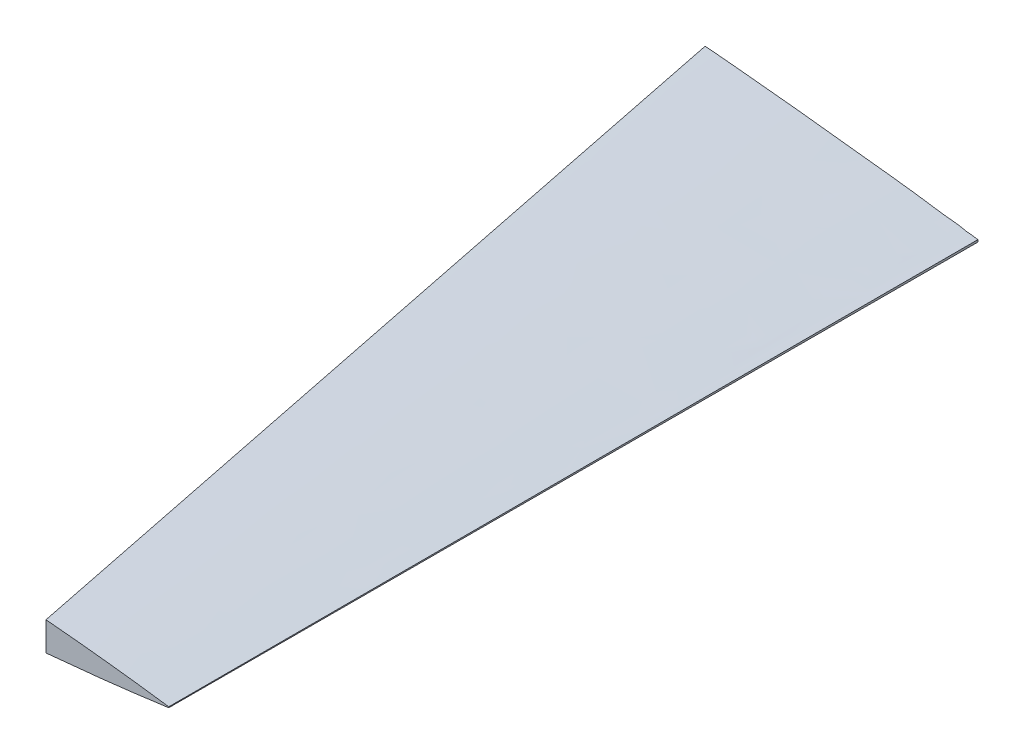
ISO-10303-21;
HEADER;
FILE_DESCRIPTION(('STEP AP214'),'2;1');
FILE_NAME('part.step','',(''),(''),'','','');
FILE_SCHEMA(('AUTOMOTIVE_DESIGN { 1 0 10303 214 1 1 1 1 }'));
ENDSEC;
DATA;
#1=APPLICATION_CONTEXT('core data for automotive mechanical design processes');
#2=APPLICATION_PROTOCOL_DEFINITION('international standard','automotive_design',2000,#1);
#3=PRODUCT_CONTEXT('',#1,'mechanical');
#4=PRODUCT('Part','Part','',(#3));
#5=PRODUCT_RELATED_PRODUCT_CATEGORY('part','',(#4));
#6=PRODUCT_DEFINITION_FORMATION('','',#4);
#7=PRODUCT_DEFINITION_CONTEXT('part definition',#1,'design');
#8=PRODUCT_DEFINITION('design','',#6,#7);
#9=PRODUCT_DEFINITION_SHAPE('','',#8);
#10=(LENGTH_UNIT() NAMED_UNIT(*) SI_UNIT(.MILLI.,.METRE.));
#11=(NAMED_UNIT(*) PLANE_ANGLE_UNIT() SI_UNIT($,.RADIAN.));
#12=(NAMED_UNIT(*) SI_UNIT($,.STERADIAN.) SOLID_ANGLE_UNIT());
#13=UNCERTAINTY_MEASURE_WITH_UNIT(LENGTH_MEASURE(1.E-05),#10,'distance_accuracy_value','');
#14=(GEOMETRIC_REPRESENTATION_CONTEXT(3) GLOBAL_UNCERTAINTY_ASSIGNED_CONTEXT((#13)) GLOBAL_UNIT_ASSIGNED_CONTEXT((#10,
#11,#12)) REPRESENTATION_CONTEXT('',''));
#15=CARTESIAN_POINT('',(0.,0.,0.));
#16=DIRECTION('',(0.,0.,1.));
#17=DIRECTION('',(1.,0.,0.));
#18=AXIS2_PLACEMENT_3D('',#15,#16,#17);
#19=CARTESIAN_POINT('',(229.0496,-21.7539406265103,0.));
#20=DIRECTION('',(-0.983219296408991,0.,0.182427561429213));
#21=DIRECTION('',(0.182427561429213,0.,0.983219296408991));
#22=AXIS2_PLACEMENT_3D('',#19,#20,#21);
#23=PLANE('',#22);
#24=CARTESIAN_POINT('',(229.0496,15.1235468839437,0.));
#25=CARTESIAN_POINT('',(229.482323493886,15.0746152727877,2.33222483414355));
#26=CARTESIAN_POINT('',(229.91504698778,15.025683664147,4.66444966833803));
#27=CARTESIAN_POINT('',(232.078664457303,14.7810256341703,16.3255738395787));
#28=CARTESIAN_POINT('',(233.809558433081,14.5852992525158,25.6544731774296));
#29=CARTESIAN_POINT('',(242.464028312923,13.6066675975319,72.2989698718214));
#30=CARTESIAN_POINT('',(249.387604219846,12.8237630840687,109.614567243774));
#31=CARTESIAN_POINT('',(263.580983422545,11.2188057671984,186.11180375789));
#32=CARTESIAN_POINT('',(270.850786718778,10.3967530852863,225.293442902517));
#33=CARTESIAN_POINT('',(285.390393336545,8.75265444502801,303.65672132814));
#34=CARTESIAN_POINT('',(292.66019665808,7.93060848668191,342.838360609136));
#35=CARTESIAN_POINT('',(299.93,7.10856794526247,382.02));
#36=B_SPLINE_CURVE_WITH_KNOTS('',3,(#24,#25,#26,#27,#28,#29,#30,#31,#32,#33,#34,#35),
.UNSPECIFIED.,.F.,.F.,(4,2,2,2,2,4),(0.,7.11760138076961,35.588006903848,149.469628996162,
269.046131327252,388.622633658346),.UNSPECIFIED.);
#37=CARTESIAN_POINT('',(229.049599998342,15.1235468611055,0.));
#38=VERTEX_POINT('',#37);
#39=CARTESIAN_POINT('',(299.929999841737,7.10856613698917,382.02));
#40=VERTEX_POINT('',#39);
#41=EDGE_CURVE('E103',#38,#40,#36,.T.);
#42=ORIENTED_EDGE('',*,*,#41,.F.);
#43=DIRECTION('',(0.,1.,0.));
#44=VECTOR('',#43,1.);
#45=CARTESIAN_POINT('',(229.0496,-21.7539406265103,0.));
#46=LINE('',#45,#44);
#47=CARTESIAN_POINT('',(229.049599999296,-15.1235468742197,0.));
#48=VERTEX_POINT('',#47);
#49=EDGE_CURVE('E100',#48,#38,#46,.T.);
#50=ORIENTED_EDGE('',*,*,#49,.F.);
#51=CARTESIAN_POINT('',(299.930000010258,-6.48856794352511,382.020000001781));
#52=CARTESIAN_POINT('',(299.497291295983,-6.54128181893893,379.687854848139));
#53=CARTESIAN_POINT('',(299.064582582957,-6.59399572316446,377.355709694916));
#54=CARTESIAN_POINT('',(296.901039022804,-6.85756537930867,365.694983930933));
#55=CARTESIAN_POINT('',(295.170204190612,-7.06842153627714,356.366403326556));
#56=CARTESIAN_POINT('',(286.516030028138,-8.12270390269963,309.723500340702));
#57=CARTESIAN_POINT('',(279.592690693321,-8.96613485689421,272.409178067313));
#58=CARTESIAN_POINT('',(265.419821170055,-10.6927390959512,196.022481434063));
#59=CARTESIAN_POINT('',(258.170290983083,-11.5759125860026,156.950107078567));
#60=CARTESIAN_POINT('',(243.671230782816,-13.3422620347552,78.8053593269384));
#61=CARTESIAN_POINT('',(236.421700769521,-14.2254379934563,39.732985930806));
#62=CARTESIAN_POINT('',(229.131313840076,-15.113592065225,0.440408366572302));
#63=CARTESIAN_POINT('',(229.090456920038,-15.1185694745733,0.220204183285911));
#64=CARTESIAN_POINT('',(229.0496,-15.1235468839438,0.));
#65=B_SPLINE_CURVE_WITH_KNOTS('',3,(#51,#52,#53,#54,#55,#56,#57,#58,#59,#60,#61,#62,#63,#64),
.UNSPECIFIED.,.F.,.F.,(4,2,2,2,2,2,4),(0.,7.11760138076971,35.5880069038481,149.469628996162,
268.716746739496,387.963861723257,388.63591492331),.UNSPECIFIED.);
#66=CARTESIAN_POINT('',(299.929999947683,-6.48856734736256,382.02));
#67=VERTEX_POINT('',#66);
#68=EDGE_CURVE('E95',#67,#48,#65,.T.);
#69=ORIENTED_EDGE('',*,*,#68,.F.);
#70=DIRECTION('',(0.,1.,0.));
#71=VECTOR('',#70,1.);
#72=CARTESIAN_POINT('',(299.93,-21.7539406265103,382.02));
#73=LINE('',#72,#71);
#74=EDGE_CURVE('E97',#67,#40,#73,.T.);
#75=ORIENTED_EDGE('',*,*,#74,.T.);
#76=EDGE_LOOP('',(#42,#50,#69,#75));
#77=FACE_BOUND('',#76,.T.);
#78=ADVANCED_FACE('F45',(#77),#23,.T.);
#79=CARTESIAN_POINT('',(0.,0.,0.));
#80=DIRECTION('',(0.,0.,1.));
#81=DIRECTION('',(1.,0.,0.));
#82=AXIS2_PLACEMENT_3D('',#79,#80,#81);
#83=PLANE('',#82);
#84=CARTESIAN_POINT('',(357.89,0.51,0.));
#85=CARTESIAN_POINT('',(357.719646917638,0.505921572841798,0.));
#86=CARTESIAN_POINT('',(357.031457109049,0.489445604421162,0.));
#87=CARTESIAN_POINT('',(355.448095415412,0.921810978975273,0.));
#88=CARTESIAN_POINT('',(352.680293301441,0.90095439623579,0.));
#89=CARTESIAN_POINT('',(348.957066021364,2.01520125980667,0.));
#90=CARTESIAN_POINT('',(344.0645014606,2.22917896767638,0.));
#91=CARTESIAN_POINT('',(338.235146468501,3.09922065903866,0.));
#92=CARTESIAN_POINT('',(331.393672923208,4.13758684020932,0.));
#93=CARTESIAN_POINT('',(323.597761630089,5.11628057463696,0.));
#94=CARTESIAN_POINT('',(314.882443830129,6.17828912685919,0.));
#95=CARTESIAN_POINT('',(305.293130734855,7.07725232689124,0.));
#96=CARTESIAN_POINT('',(294.985863675319,8.42983706148255,0.));
#97=CARTESIAN_POINT('',(283.977867006548,9.69066102593276,0.));
#98=CARTESIAN_POINT('',(272.375704707007,10.941886728925,0.));
#99=CARTESIAN_POINT('',(260.101492172459,12.2387824025472,0.));
#100=CARTESIAN_POINT('',(247.312075014399,13.4440845936858,0.));
#101=CARTESIAN_POINT('',(234.122924460674,14.8365121456862,0.));
#102=CARTESIAN_POINT('',(220.62780271951,15.648425333477,0.));
#103=CARTESIAN_POINT('',(206.943423861164,17.1374754411791,0.));
#104=CARTESIAN_POINT('',(193.035803629134,17.9766016297824,0.));
#105=CARTESIAN_POINT('',(178.998423130644,19.1472716709331,0.));
#106=CARTESIAN_POINT('',(164.930628496034,19.7652584635785,0.));
#107=CARTESIAN_POINT('',(150.970022584434,20.6192056737092,0.));
#108=CARTESIAN_POINT('',(137.249966534669,21.1393456722067,0.));
#109=CARTESIAN_POINT('',(123.783214426583,21.2841033943283,0.));
#110=CARTESIAN_POINT('',(110.659687231223,21.7439406265103,0.));
#111=CARTESIAN_POINT('',(97.8741361414242,21.2812625614655,0.));
#112=CARTESIAN_POINT('',(85.6735500131455,21.1922492666694,0.));
#113=CARTESIAN_POINT('',(73.9996496969005,20.5135685894506,0.));
#114=CARTESIAN_POINT('',(62.9682496415754,20.2247733516122,0.));
#115=CARTESIAN_POINT('',(52.6401030806784,19.1522879815025,0.));
#116=CARTESIAN_POINT('',(43.1755939216454,17.8091818067298,0.));
#117=CARTESIAN_POINT('',(34.518431340811,16.6108019228167,0.));
#118=CARTESIAN_POINT('',(26.6936934738994,15.1655174934838,0.));
#119=CARTESIAN_POINT('',(19.8862932147171,13.2851537730244,0.));
#120=CARTESIAN_POINT('',(13.8083523401894,11.6800943694312,0.));
#121=CARTESIAN_POINT('',(9.04993148298527,9.28720173126534,0.));
#122=CARTESIAN_POINT('',(4.93777046882712,7.46902396666879,0.));
#123=CARTESIAN_POINT('',(2.40834869494993,4.9776750118051,0.));
#124=CARTESIAN_POINT('',(0.307350295607263,2.75818606627847,0.));
#125=CARTESIAN_POINT('',(-0.145006844762799,0.,0.));
#126=CARTESIAN_POINT('',(0.307350295607263,-2.75818606627847,0.));
#127=CARTESIAN_POINT('',(2.40834869494993,-4.97767501180511,0.));
#128=CARTESIAN_POINT('',(4.9377704688271,-7.46902396666878,0.));
#129=CARTESIAN_POINT('',(9.0499314829853,-9.28720173126536,0.));
#130=CARTESIAN_POINT('',(13.8083523401894,-11.6800943694312,0.));
#131=CARTESIAN_POINT('',(19.8862932147171,-13.2851537730243,0.));
#132=CARTESIAN_POINT('',(26.6936934738993,-15.1655174934838,0.));
#133=CARTESIAN_POINT('',(34.5184313408111,-16.6108019228167,0.));
#134=CARTESIAN_POINT('',(43.1755939216453,-17.8091818067298,0.));
#135=CARTESIAN_POINT('',(52.6401030806785,-19.1522879815025,0.));
#136=CARTESIAN_POINT('',(62.9682496415753,-20.2247733516122,0.));
#137=CARTESIAN_POINT('',(73.9996496969005,-20.5135685894506,0.));
#138=CARTESIAN_POINT('',(85.6735500131454,-21.1922492666694,0.));
#139=CARTESIAN_POINT('',(97.8741361414243,-21.2812625614655,0.));
#140=CARTESIAN_POINT('',(110.659687231223,-21.7439406265103,0.));
#141=CARTESIAN_POINT('',(123.783214426583,-21.2841033943283,0.));
#142=CARTESIAN_POINT('',(137.249966534669,-21.1393456722067,0.));
#143=CARTESIAN_POINT('',(150.970022584434,-20.6192056737092,0.));
#144=CARTESIAN_POINT('',(164.930628496034,-19.7652584635785,0.));
#145=CARTESIAN_POINT('',(178.998423130644,-19.1472716709331,0.));
#146=CARTESIAN_POINT('',(193.035803629134,-17.9766016297824,0.));
#147=CARTESIAN_POINT('',(206.943423861164,-17.1374754411791,0.));
#148=CARTESIAN_POINT('',(220.62780271951,-15.648425333477,0.));
#149=CARTESIAN_POINT('',(234.122924460674,-14.8365121456862,0.));
#150=CARTESIAN_POINT('',(247.312075014399,-13.4440845936858,0.));
#151=CARTESIAN_POINT('',(260.101492172459,-12.2387824025472,0.));
#152=CARTESIAN_POINT('',(272.375704707007,-10.941886728925,0.));
#153=CARTESIAN_POINT('',(283.977867006547,-9.69066102593277,0.));
#154=CARTESIAN_POINT('',(294.985863675319,-8.42983706148255,0.));
#155=CARTESIAN_POINT('',(305.293130734855,-7.07725232689124,0.));
#156=CARTESIAN_POINT('',(314.882443830129,-6.17828912685919,0.));
#157=CARTESIAN_POINT('',(323.597761630088,-5.11628057463696,0.));
#158=CARTESIAN_POINT('',(331.393672923209,-4.13758684020931,0.));
#159=CARTESIAN_POINT('',(338.235146468501,-3.09922065903867,0.));
#160=CARTESIAN_POINT('',(344.0645014606,-2.22917896767638,0.));
#161=CARTESIAN_POINT('',(348.957066021365,-2.01520125980667,0.));
#162=CARTESIAN_POINT('',(352.680293301441,-0.900954396235786,0.));
#163=CARTESIAN_POINT('',(355.448095415412,-0.921810978975272,0.));
#164=CARTESIAN_POINT('',(357.031457109049,-0.489445604421162,0.));
#165=CARTESIAN_POINT('',(357.719646917638,-0.505921572841798,0.));
#166=CARTESIAN_POINT('',(357.89,-0.51,0.));
#167=B_SPLINE_CURVE_WITH_KNOTS('',3,(#84,#85,#86,#87,#88,#89,#90,#91,#92,#93,#94,#95,#96,#97,
#98,#99,#100,#101,#102,#103,#104,#105,#106,#107,#108,#109,#110,#111,#112,#113,#114,#115,#116,
#117,#118,#119,#120,#121,#122,#123,#124,#125,#126,#127,#128,#129,#130,#131,#132,#133,#134,#135,
#136,#137,#138,#139,#140,#141,#142,#143,#144,#145,#146,#147,#148,#149,#150,#151,#152,#153,#154,
#155,#156,#157,#158,#159,#160,#161,#162,#163,#164,#165,#166),.UNSPECIFIED.,.F.,.F.,(4,1,1,1,1,1,
1,1,1,1,1,1,1,1,1,1,1,1,1,1,1,1,1,1,1,1,1,1,1,1,1,1,1,1,1,1,1,1,1,1,1,1,1,1,1,1,1,1,1,1,1,1,1,1,
1,1,1,1,1,1,1,1,1,1,1,1,1,1,1,1,1,1,1,1,1,1,1,1,1,1,4),(0.,0.000698767546102638,
0.00282287057641789,0.00666210294870497,0.0119851512501213,0.0186396801468936,
0.0267087250122721,0.0362091585625878,0.0470822882687063,0.0590024405257511,0.0722964396022678,
0.0866652687945305,0.101727960502694,0.1178390518878,0.134631365152862,0.15245969992926,
0.170642601576784,0.189137461126776,0.208016041696824,0.227206750787311,0.246398452739791,
0.265909542840843,0.285078596718305,0.303889796655365,0.322335219621859,0.340437910137479,
0.357841963230223,0.374903831461308,0.390580026839433,0.405899731285183,0.420244749695898,
0.433227432414806,0.445192580255448,0.456174796493744,0.465885160109924,0.474250152506373,
0.481884938165317,0.48779988101342,0.492476430267749,0.496450404883876,0.5,0.503549595116124,
0.507523569732251,0.51220011898658,0.518115061834683,0.525749847493627,0.534114839890076,
0.543825203506256,0.554807419744552,0.566772567585194,0.579755250304102,0.594100268714817,
0.609419973160567,0.625096168538692,0.642158036769777,0.659562089862521,0.677664780378141,
0.696110203344635,0.714921403281695,0.734090457159157,0.753601547260209,0.772793249212689,
0.791983958303176,0.810862538873224,0.829357398423216,0.847540300070741,0.865368634847139,
0.8821609481122,0.898272039497306,0.91333473120547,0.927703560397732,0.940997559474249,
0.952917711731294,0.963790841437412,0.973291274987728,0.981360319853106,0.988014848749879,
0.993337897051295,0.997177129423582,0.999301232453897,1.),.UNSPECIFIED.);
#168=CARTESIAN_POINT('',(357.89,-0.51,0.));
#169=VERTEX_POINT('',#168);
#170=EDGE_CURVE('E11',#48,#169,#167,.T.);
#171=ORIENTED_EDGE('',*,*,#170,.F.);
#172=ORIENTED_EDGE('',*,*,#49,.T.);
#173=CARTESIAN_POINT('',(357.89,0.51,0.));
#174=VERTEX_POINT('',#173);
#175=EDGE_CURVE('E59',#174,#38,#167,.T.);
#176=ORIENTED_EDGE('',*,*,#175,.F.);
#177=DIRECTION('',(0.,1.,0.));
#178=VECTOR('',#177,1.);
#179=CARTESIAN_POINT('',(357.89,0.51,0.));
#180=LINE('',#179,#178);
#181=EDGE_CURVE('E176',#169,#174,#180,.T.);
#182=ORIENTED_EDGE('',*,*,#181,.F.);
#183=EDGE_LOOP('',(#171,#172,#176,#182));
#184=FACE_BOUND('',#183,.T.);
#185=ADVANCED_FACE('F159',(#184),#83,.F.);
#186=CARTESIAN_POINT('',(357.89,0.,0.));
#187=DIRECTION('',(-1.,0.,0.));
#188=DIRECTION('',(0.,0.,1.));
#189=AXIS2_PLACEMENT_3D('',#186,#187,#188);
#190=PLANE('',#189);
#191=DIRECTION('',(0.,0.,-1.));
#192=VECTOR('',#191,1.);
#193=CARTESIAN_POINT('',(357.89,0.51,191.01));
#194=LINE('',#193,#192);
#195=CARTESIAN_POINT('',(357.89,0.51,382.02));
#196=VERTEX_POINT('',#195);
#197=EDGE_CURVE('E67',#196,#174,#194,.T.);
#198=ORIENTED_EDGE('',*,*,#197,.F.);
#199=DIRECTION('',(0.,1.,0.));
#200=VECTOR('',#199,1.);
#201=CARTESIAN_POINT('',(357.89,0.51,382.02));
#202=LINE('',#201,#200);
#203=CARTESIAN_POINT('',(357.89,0.11,382.02));
#204=VERTEX_POINT('',#203);
#205=EDGE_CURVE('E102',#204,#196,#202,.T.);
#206=ORIENTED_EDGE('',*,*,#205,.F.);
#207=DIRECTION('',(0.,0.00162294954052209,0.999998683016527));
#208=VECTOR('',#207,1.);
#209=CARTESIAN_POINT('',(357.89,-0.2,191.01));
#210=LINE('',#209,#208);
#211=EDGE_CURVE('E115',#169,#204,#210,.T.);
#212=ORIENTED_EDGE('',*,*,#211,.F.);
#213=ORIENTED_EDGE('',*,*,#181,.T.);
#214=EDGE_LOOP('',(#198,#206,#212,#213));
#215=FACE_BOUND('',#214,.T.);
#216=ADVANCED_FACE('F151',(#215),#190,.F.);
#217=CARTESIAN_POINT('',(196.89,0.31,382.02));
#218=DIRECTION('',(0.,0.,-1.));
#219=DIRECTION('',(-1.,0.,0.));
#220=AXIS2_PLACEMENT_3D('',#217,#218,#219);
#221=PLANE('',#220);
#222=ORIENTED_EDGE('',*,*,#74,.F.);
#223=CARTESIAN_POINT('',(357.89,0.51,382.02));
#224=CARTESIAN_POINT('',(357.806708450135,0.523616929023838,382.02));
#225=CARTESIAN_POINT('',(357.477757543041,0.577395507540505,382.02));
#226=CARTESIAN_POINT('',(356.735929251304,0.668207308103863,382.02));
#227=CARTESIAN_POINT('',(355.506721289244,0.843623982290788,382.02));
#228=CARTESIAN_POINT('',(353.79442463927,1.08474454915982,382.02));
#229=CARTESIAN_POINT('',(351.6097148269,1.36786042515621,382.02));
#230=CARTESIAN_POINT('',(348.970793308962,1.72271684994328,382.02));
#231=CARTESIAN_POINT('',(345.890024605038,2.11684627330626,382.02));
#232=CARTESIAN_POINT('',(342.384959477384,2.57296930570351,382.02));
#233=CARTESIAN_POINT('',(338.476676034793,3.04345907258176,382.02));
#234=CARTESIAN_POINT('',(334.194743391836,3.56844857624299,382.02));
#235=CARTESIAN_POINT('',(329.564880021649,4.10702445897474,382.02));
#236=CARTESIAN_POINT('',(324.61053811686,4.65159250747444,382.02));
#237=CARTESIAN_POINT('',(319.36810887888,5.22351623460242,382.02));
#238=CARTESIAN_POINT('',(313.865108349675,5.79444176379778,382.02));
#239=CARTESIAN_POINT('',(308.13727352458,6.34625344854203,382.02));
#240=CARTESIAN_POINT('',(302.218947217218,6.91509363260335,382.02));
#241=CARTESIAN_POINT('',(296.144359296961,7.43556950912298,382.02));
#242=CARTESIAN_POINT('',(289.95852789448,7.95011430848334,382.02));
#243=CARTESIAN_POINT('',(283.695239198178,8.42038142674189,382.02));
#244=CARTESIAN_POINT('',(277.391517886532,8.83757523401212,382.02));
#245=CARTESIAN_POINT('',(271.088226722719,9.20884169747183,382.02));
#246=CARTESIAN_POINT('',(264.824786478958,9.51907856309602,382.02));
#247=CARTESIAN_POINT('',(258.638098512786,9.76488067881417,382.02));
#248=CARTESIAN_POINT('',(252.563996104545,9.91076428473279,382.02));
#249=CARTESIAN_POINT('',(246.643582622431,9.98355420197383,382.02));
#250=CARTESIAN_POINT('',(240.915871684702,9.97223823955458,382.02));
#251=CARTESIAN_POINT('',(235.411809077091,9.83678180894192,382.02));
#252=CARTESIAN_POINT('',(230.166954947183,9.62520799462967,382.02));
#253=CARTESIAN_POINT('',(225.211940853357,9.30819354309595,382.02));
#254=CARTESIAN_POINT('',(220.5796293594,8.89398006186397,382.02));
#255=CARTESIAN_POINT('',(216.293073929223,8.38115666749742,382.02));
#256=CARTESIAN_POINT('',(212.383328821964,7.76783328684578,382.02));
#257=CARTESIAN_POINT('',(208.873840562401,7.07079208424317,382.02));
#258=CARTESIAN_POINT('',(205.780404232968,6.32443658080431,382.02));
#259=CARTESIAN_POINT('',(203.136694712803,5.46428267250967,382.02));
#260=CARTESIAN_POINT('',(200.932972041348,4.57455127871715,382.02));
#261=CARTESIAN_POINT('',(199.183060998198,3.62443268839254,382.02));
#262=CARTESIAN_POINT('',(197.910714361493,2.59930099190346,382.02));
#263=CARTESIAN_POINT('',(197.086986489989,1.50619227407771,382.02));
#264=CARTESIAN_POINT('',(196.797785549145,0.309999999999987,382.02));
#265=CARTESIAN_POINT('',(197.086986489989,-0.886192274077687,382.02));
#266=CARTESIAN_POINT('',(197.910714361493,-1.97930099190348,382.02));
#267=CARTESIAN_POINT('',(199.183060998198,-3.00443268839252,382.02));
#268=CARTESIAN_POINT('',(200.932972041348,-3.95455127871715,382.02));
#269=CARTESIAN_POINT('',(203.136694712803,-4.84428267250967,382.02));
#270=CARTESIAN_POINT('',(205.780404232968,-5.7044365808043,382.02));
#271=CARTESIAN_POINT('',(208.873840562401,-6.45079208424317,382.02));
#272=CARTESIAN_POINT('',(212.383328821964,-7.14783328684577,382.02));
#273=CARTESIAN_POINT('',(216.293073929223,-7.76115666749742,382.02));
#274=CARTESIAN_POINT('',(220.579629359399,-8.27398006186396,382.02));
#275=CARTESIAN_POINT('',(225.211940853357,-8.68819354309595,382.02));
#276=CARTESIAN_POINT('',(230.166954947183,-9.00520799462967,382.02));
#277=CARTESIAN_POINT('',(235.411809077091,-9.21678180894192,382.02));
#278=CARTESIAN_POINT('',(240.915871684702,-9.35223823955459,382.02));
#279=CARTESIAN_POINT('',(246.643582622431,-9.36355420197382,382.02));
#280=CARTESIAN_POINT('',(252.563996104545,-9.29076428473279,382.02));
#281=CARTESIAN_POINT('',(258.638098512786,-9.14488067881417,382.02));
#282=CARTESIAN_POINT('',(264.824786478959,-8.89907856309602,382.02));
#283=CARTESIAN_POINT('',(271.088226722719,-8.58884169747183,382.02));
#284=CARTESIAN_POINT('',(277.391517886532,-8.21757523401213,382.02));
#285=CARTESIAN_POINT('',(283.695239198178,-7.80038142674189,382.02));
#286=CARTESIAN_POINT('',(289.95852789448,-7.33011430848334,382.02));
#287=CARTESIAN_POINT('',(296.144359296961,-6.81556950912299,382.02));
#288=CARTESIAN_POINT('',(302.218947217218,-6.29509363260335,382.02));
#289=CARTESIAN_POINT('',(308.13727352458,-5.72625344854203,382.02));
#290=CARTESIAN_POINT('',(313.865108349675,-5.17444176379778,382.02));
#291=CARTESIAN_POINT('',(319.36810887888,-4.60351623460242,382.02));
#292=CARTESIAN_POINT('',(324.61053811686,-4.03159250747444,382.02));
#293=CARTESIAN_POINT('',(329.564880021649,-3.48702445897473,382.02));
#294=CARTESIAN_POINT('',(334.194743391836,-2.94844857624299,382.02));
#295=CARTESIAN_POINT('',(338.476676034793,-2.42345907258176,382.02));
#296=CARTESIAN_POINT('',(342.384959477384,-1.95296930570351,382.02));
#297=CARTESIAN_POINT('',(345.890024605038,-1.49684627330626,382.02));
#298=CARTESIAN_POINT('',(348.970793308962,-1.10271684994328,382.02));
#299=CARTESIAN_POINT('',(351.6097148269,-0.747860425156201,382.02));
#300=CARTESIAN_POINT('',(353.79442463927,-0.464744549159827,382.02));
#301=CARTESIAN_POINT('',(355.506721289244,-0.223623982290783,382.02));
#302=CARTESIAN_POINT('',(356.735929251304,-0.0482073081038664,382.02));
#303=CARTESIAN_POINT('',(357.477757543042,0.0426044924594901,382.02));
#304=CARTESIAN_POINT('',(357.806708450135,0.0963830709761626,382.02));
#305=CARTESIAN_POINT('',(357.89,0.11,382.02));
#306=B_SPLINE_CURVE_WITH_KNOTS('',3,(#223,#224,#225,#226,#227,#228,#229,#230,#231,#232,#233,
#234,#235,#236,#237,#238,#239,#240,#241,#242,#243,#244,#245,#246,#247,#248,#249,#250,#251,#252,
#253,#254,#255,#256,#257,#258,#259,#260,#261,#262,#263,#264,#265,#266,#267,#268,#269,#270,#271,
#272,#273,#274,#275,#276,#277,#278,#279,#280,#281,#282,#283,#284,#285,#286,#287,#288,#289,#290,
#291,#292,#293,#294,#295,#296,#297,#298,#299,#300,#301,#302,#303,#304,#305),.UNSPECIFIED.,.F.,
.F.,(4,1,1,1,1,1,1,1,1,1,1,1,1,1,1,1,1,1,1,1,1,1,1,1,1,1,1,1,1,1,1,1,1,1,1,1,1,1,1,1,1,1,1,1,1,
1,1,1,1,1,1,1,1,1,1,1,1,1,1,1,1,1,1,1,1,1,1,1,1,1,1,1,1,1,1,1,1,1,1,1,4),(0.,
0.000771236395981759,0.00304591417078036,0.00682835830566971,0.0121185836321505,
0.0188479986344749,0.0269603345763291,0.0364516328626156,0.0472313100617401,0.0592616044058275,
0.072425456470369,0.0866552243772794,0.101856986328281,0.117973805943372,0.13484794273917,
0.152416150492632,0.170560488459476,0.189181970385419,0.208132203001233,0.227285466442462,
0.24657991935761,0.265864871507824,0.284987879614343,0.303888468235029,0.322445456356162,
0.34051068451839,0.357995982198018,0.374785218524854,0.390822242484855,0.405962809542978,
0.420154966353137,0.433318818417679,0.445408359355525,0.456311076918097,0.466011683531353,
0.474469595450701,0.481693780795275,0.487709005099918,0.49259604517074,0.496534017999032,0.5,
0.503465982000968,0.50740395482926,0.512290994900082,0.518306219204725,0.525530404549299,
0.533988316468647,0.543688923081903,0.554591640644475,0.566681181582322,0.579845033646863,
0.594037190457022,0.609177757515145,0.625214781475146,0.642004017801982,0.65948931548161,
0.677554543643838,0.696111531764971,0.715012120385657,0.734135128492176,0.75342008064239,
0.772714533557538,0.791867796998767,0.810818029614581,0.829439511540525,0.847583849507368,
0.86515205726083,0.882026194056628,0.898143013671719,0.913344775622721,0.927574543529631,
0.940738395594173,0.95276868993826,0.963548367137384,0.973039665423671,0.981152001365525,
0.98788141636785,0.99317164169433,0.99695408582922,0.999228763604018,1.),.UNSPECIFIED.);
#307=EDGE_CURVE('E107',#67,#204,#306,.T.);
#308=ORIENTED_EDGE('',*,*,#307,.T.);
#309=ORIENTED_EDGE('',*,*,#205,.T.);
#310=EDGE_CURVE('E109',#196,#40,#306,.T.);
#311=ORIENTED_EDGE('',*,*,#310,.T.);
#312=EDGE_LOOP('',(#222,#308,#309,#311));
#313=FACE_BOUND('',#312,.T.);
#314=ADVANCED_FACE('F106',(#313),#221,.F.);
#315=CARTESIAN_POINT('',(357.89,0.51,0.));
#316=CARTESIAN_POINT('',(357.89,0.51,382.02));
#317=CARTESIAN_POINT('',(357.719646917638,0.505921572841798,0.));
#318=CARTESIAN_POINT('',(357.814534899787,0.522337420963294,382.02));
#319=CARTESIAN_POINT('',(357.531626598123,0.50142017394268,0.));
#320=CARTESIAN_POINT('',(357.731243349922,0.535954349987132,382.02));
#321=CARTESIAN_POINT('',(356.848159706481,0.539498255331223,0.));
#322=CARTESIAN_POINT('',(357.425964883524,0.582973445109446,382.02));
#323=CARTESIAN_POINT('',(356.290104693997,0.689922411039832,0.));
#324=CARTESIAN_POINT('',(357.171082766505,0.614937468334944,382.02));
#325=CARTESIAN_POINT('',(354.872495864666,0.917473588092323,0.));
#326=CARTESIAN_POINT('',(356.531728992991,0.697590485265919,382.02));
#327=CARTESIAN_POINT('',(353.891174296478,0.91712103612509,0.));
#328=CARTESIAN_POINT('',(356.097797719825,0.759273193129745,382.02));
#329=CARTESIAN_POINT('',(351.737414074306,1.1831290104969,0.));
#330=CARTESIAN_POINT('',(355.129330927236,0.896750550644133,382.02));
#331=CARTESIAN_POINT('',(350.452319580133,1.56299458820433,0.));
#332=CARTESIAN_POINT('',(354.538075302099,0.980025854898135,382.02));
#333=CARTESIAN_POINT('',(347.625361161879,2.07344375203188,0.));
#334=CARTESIAN_POINT('',(353.257400114698,1.15419268816755,382.02));
#335=CARTESIAN_POINT('',(345.95063186007,2.14826775303112,0.));
#336=CARTESIAN_POINT('',(352.512667181549,1.25084710584855,382.02));
#337=CARTESIAN_POINT('',(342.41300040448,2.47566846335827,0.));
#338=CARTESIAN_POINT('',(350.929798141801,1.45936369831534,382.02));
#339=CARTESIAN_POINT('',(340.410697870621,2.77457559121202,0.));
#340=CARTESIAN_POINT('',(350.027412597817,1.58063299460491,382.02));
#341=CARTESIAN_POINT('',(336.233728844818,3.40298626758381,0.));
#342=CARTESIAN_POINT('',(348.143884123107,1.82840998082946,382.02));
#343=CARTESIAN_POINT('',(333.89010322889,3.75792850422848,0.));
#344=CARTESIAN_POINT('',(347.086386047061,1.96379315877758,382.02));
#345=CARTESIAN_POINT('',(329.041672104144,4.43285552380992,0.));
#346=CARTESIAN_POINT('',(344.90259218142,2.24536271627681,382.02));
#347=CARTESIAN_POINT('',(326.380841867492,4.76679013522718,0.));
#348=CARTESIAN_POINT('',(343.706557559944,2.40098638867542,382.02));
#349=CARTESIAN_POINT('',(320.935838914193,5.44065023671036,0.));
#350=CARTESIAN_POINT('',(341.258157392253,2.70847039687676,382.02));
#351=CARTESIAN_POINT('',(317.994399140165,5.79859038470487,0.));
#352=CARTESIAN_POINT('',(339.934985041309,2.86790387690817,382.02));
#353=CARTESIAN_POINT('',(311.931901092475,6.45489176929248,0.));
#354=CARTESIAN_POINT('',(337.212198212164,3.19850790804827,382.02));
#355=CARTESIAN_POINT('',(308.680189119718,6.76086499111407,0.));
#356=CARTESIAN_POINT('',(335.75428790457,3.37723947326357,382.02));
#357=CARTESIAN_POINT('',(302.057339678058,7.50192022971771,0.));
#358=CARTESIAN_POINT('',(332.777934731162,3.73326099381836,382.02));
#359=CARTESIAN_POINT('',(298.590914192743,7.95650563652986,0.));
#360=CARTESIAN_POINT('',(331.216128898059,3.9149404275216,382.02));
#361=CARTESIAN_POINT('',(291.515235904124,8.82735268555818,0.));
#362=CARTESIAN_POINT('',(328.030029794579,4.27568470650152,382.02));
#363=CARTESIAN_POINT('',(287.840854121478,9.2482057022785,0.));
#364=CARTESIAN_POINT('',(326.376523234059,4.45747970109626,382.02));
#365=CARTESIAN_POINT('',(280.30325544094,10.0869465045096,0.));
#366=CARTESIAN_POINT('',(322.985575912316,4.82886179003519,382.02));
#367=CARTESIAN_POINT('',(276.373664836544,10.5106963267728,0.));
#368=CARTESIAN_POINT('',(321.218344967146,5.02166440759029,382.02));
#369=CARTESIAN_POINT('',(268.445128661394,11.3571921551631,0.));
#370=CARTESIAN_POINT('',(317.652142216751,5.40147946754914,382.02));
#371=CARTESIAN_POINT('',(264.32992128726,11.7918226744726,0.));
#372=CARTESIAN_POINT('',(315.800854020201,5.59361194096433,382.02));
#373=CARTESIAN_POINT('',(255.992352942864,12.6259753243305,0.));
#374=CARTESIAN_POINT('',(312.050737425783,5.96923574910577,382.02));
#375=CARTESIAN_POINT('',(251.67422672268,13.0332793129867,0.));
#376=CARTESIAN_POINT('',(310.108843548479,6.15631511936526,382.02));
#377=CARTESIAN_POINT('',(243.028468202819,13.896434921151,0.));
#378=CARTESIAN_POINT('',(306.218915353608,6.53063652551323,382.02));
#379=CARTESIAN_POINT('',(238.618100366479,14.3619397494704,0.));
#380=CARTESIAN_POINT('',(304.233599518537,6.72143068080092,382.02));
#381=CARTESIAN_POINT('',(229.726084477071,15.1010412426268,0.));
#382=CARTESIAN_POINT('',(300.236611288995,7.08491635787435,382.02));
#383=CARTESIAN_POINT('',(225.202763509631,15.3731798729048,0.));
#384=CARTESIAN_POINT('',(298.206357077806,7.25888471267602,382.02));
#385=CARTESIAN_POINT('',(216.142634108068,16.1364738501882,0.));
#386=CARTESIAN_POINT('',(294.13121546356,7.60300919814356,382.02));
#387=CARTESIAN_POINT('',(211.547277388398,16.6362508741476,0.));
#388=CARTESIAN_POINT('',(292.059849339418,7.77532389618019,382.02));
#389=CARTESIAN_POINT('',(202.329957538737,17.4158322230584,0.));
#390=CARTESIAN_POINT('',(287.911932655411,8.10374386542262,382.02));
#391=CARTESIAN_POINT('',(197.649799941096,17.6985389554026,0.));
#392=CARTESIAN_POINT('',(285.809247623404,8.2616551252236,382.02));
#393=CARTESIAN_POINT('',(188.363565091191,18.3662505163441,0.));
#394=CARTESIAN_POINT('',(281.632333068731,8.55682017086573,382.02));
#395=CARTESIAN_POINT('',(183.666147607275,18.7576212198825,0.));
#396=CARTESIAN_POINT('',(279.517019479022,8.69690497625632,382.02));
#397=CARTESIAN_POINT('',(174.299935963742,19.3534588925827,0.));
#398=CARTESIAN_POINT('',(275.303655160875,8.96055121436889,382.02));
#399=CARTESIAN_POINT('',(169.557113997913,19.562403020399,0.));
#400=CARTESIAN_POINT('',(273.172304406722,9.0860886576381,382.02));
#401=CARTESIAN_POINT('',(160.225644152077,20.0532434236128,0.));
#402=CARTESIAN_POINT('',(268.975628445618,9.31348161456275,382.02));
#403=CARTESIAN_POINT('',(155.559969467064,20.3384462023877,0.));
#404=CARTESIAN_POINT('',(266.875695952065,9.41746998820749,382.02));
#405=CARTESIAN_POINT('',(146.331396149654,20.7950565529334,0.));
#406=CARTESIAN_POINT('',(262.723901115832,9.60254843743936,382.02));
#407=CARTESIAN_POINT('',(141.735344068475,20.9693008666146,0.));
#408=CARTESIAN_POINT('',(260.657107241791,9.6845851358407,382.02));
#409=CARTESIAN_POINT('',(132.674261720871,21.1885311477119,0.));
#410=CARTESIAN_POINT('',(256.582316951724,9.81416119693134,382.02));
#411=CARTESIAN_POINT('',(128.160073529847,21.2370553645769,0.));
#412=CARTESIAN_POINT('',(254.552216360073,9.86301172245867,382.02));
#413=CARTESIAN_POINT('',(119.269666219517,21.442254285012,0.));
#414=CARTESIAN_POINT('',(250.553525202291,9.93543617415205,382.02));
#415=CARTESIAN_POINT('',(114.848599561952,21.5961871554698,0.));
#416=CARTESIAN_POINT('',(248.564776906431,9.95993362659361,382.02));
#417=CARTESIAN_POINT('',(106.239115203847,21.5839708530017,0.));
#418=CARTESIAN_POINT('',(244.691463449123,9.97957871643179,382.02));
#419=CARTESIAN_POINT('',(101.96869942588,21.4296954955242,0.));
#420=CARTESIAN_POINT('',(242.770027390626,9.97590140561093,382.02));
#421=CARTESIAN_POINT('',(93.6307587261663,21.2507125200036,0.));
#422=CARTESIAN_POINT('',(239.019837314956,9.92557633427582,382.02));
#423=CARTESIAN_POINT('',(89.4793012196511,21.2190309222449,0.));
#424=CARTESIAN_POINT('',(237.153276334887,9.87963977688066,382.02));
#425=CARTESIAN_POINT('',(81.5577976312203,20.9529734858112,0.));
#426=CARTESIAN_POINT('',(233.589539281792,9.76307058160974,382.02));
#427=CARTESIAN_POINT('',(77.662181445629,20.7264956712506,0.));
#428=CARTESIAN_POINT('',(231.835998346148,9.6923809223827,382.02));
#429=CARTESIAN_POINT('',(70.1267162168749,20.4121775837861,0.));
#430=CARTESIAN_POINT('',(228.448832954012,9.51520465346787,382.02));
#431=CARTESIAN_POINT('',(66.3842417153194,20.3118396237718,0.));
#432=CARTESIAN_POINT('',(226.768812867278,9.40779990510739,382.02));
#433=CARTESIAN_POINT('',(59.2647121098714,19.8393774512328,0.));
#434=CARTESIAN_POINT('',(223.568429037719,9.16123348838255,382.02));
#435=CARTESIAN_POINT('',(55.7906978773665,19.4791472683861,0.));
#436=CARTESIAN_POINT('',(222.004759678332,9.02141281145008,382.02));
#437=CARTESIAN_POINT('',(49.2064298703973,18.6650162579099,0.));
#438=CARTESIAN_POINT('',(219.037553724668,8.70934950525809,382.02));
#439=CARTESIAN_POINT('',(46.0356392126038,18.2150501329018,0.));
#440=CARTESIAN_POINT('',(217.607045681344,8.53816695330641,382.02));
#441=CARTESIAN_POINT('',(40.0254633594931,17.3731205612427,0.));
#442=CARTESIAN_POINT('',(214.902870321049,8.16265368880304,382.02));
#443=CARTESIAN_POINT('',(37.090596102172,16.9663195296182,0.));
#444=CARTESIAN_POINT('',(213.585628716715,7.95643858355346,382.02));
#445=CARTESIAN_POINT('',(31.599901271085,16.0717287758233,0.));
#446=CARTESIAN_POINT('',(211.123394718728,7.51729247674824,382.02));
#447=CARTESIAN_POINT('',(28.9365451992354,15.577302296888,0.));
#448=CARTESIAN_POINT('',(209.929803062142,7.28052333743007,382.02));
#449=CARTESIAN_POINT('',(24.0889315753678,14.4460211236579,0.));
#450=CARTESIAN_POINT('',(207.741324641662,6.79727259518802,382.02));
#451=CARTESIAN_POINT('',(21.7842580711493,13.8096291321678,0.));
#452=CARTESIAN_POINT('',(206.694178308642,6.54490347834165,382.02));
#453=CARTESIAN_POINT('',(17.560828868089,12.6710463813387,0.));
#454=CARTESIAN_POINT('',(204.806318982062,6.00658089514266,382.02));
#455=CARTESIAN_POINT('',(15.5327552460635,12.1319539381818,0.));
#456=CARTESIAN_POINT('',(203.911978191945,5.71652790200032,382.02));
#457=CARTESIAN_POINT('',(11.9875973364714,10.7594801782619,0.));
#458=CARTESIAN_POINT('',(202.299941623212,5.12645182731999,382.02));
#459=CARTESIAN_POINT('',(10.3270994759309,9.93110979928305,0.));
#460=CARTESIAN_POINT('',(201.52450258134,4.81337592695258,382.02));
#461=CARTESIAN_POINT('',(7.39067695168028,8.55410809380583,0.));
#462=CARTESIAN_POINT('',(200.217101569994,4.1858676106188,382.02));
#463=CARTESIAN_POINT('',(6.0133833926362,7.94460249937922,0.));
#464=CARTESIAN_POINT('',(199.628780763158,3.86402553743222,382.02));
#465=CARTESIAN_POINT('',(3.92636987305171,6.4728469576557,0.));
#466=CARTESIAN_POINT('',(198.670370515368,3.2100223840894,382.02));
#467=CARTESIAN_POINT('',(3.07769225744221,5.63694362492524,0.));
#468=CARTESIAN_POINT('',(198.251724342673,2.87233804212059,382.02));
#469=CARTESIAN_POINT('',(1.58239501133441,4.10513980622132,0.));
#470=CARTESIAN_POINT('',(197.597530415462,2.18197929054,382.02));
#471=CARTESIAN_POINT('',(0.892106591202139,3.36263628188347,0.));
#472=CARTESIAN_POINT('',(197.324876136309,1.82187813984602,382.02));
#473=CARTESIAN_POINT('',(0.141591110400744,1.74749200578398,0.));
#474=CARTESIAN_POINT('',(196.984439026025,1.08203568675061,382.02));
#475=CARTESIAN_POINT('',(-0.138255835973195,0.,0.));
#476=CARTESIAN_POINT('',(196.797785549145,0.309999999999987,382.02));
#477=CARTESIAN_POINT('',(0.141591110400746,-1.74749200578399,0.));
#478=CARTESIAN_POINT('',(196.984439026025,-0.462035686750603,382.02));
#479=CARTESIAN_POINT('',(0.892106591202149,-3.36263628188348,0.));
#480=CARTESIAN_POINT('',(197.324876136309,-1.20187813984601,382.02));
#481=CARTESIAN_POINT('',(1.58239501133441,-4.10513980622132,0.));
#482=CARTESIAN_POINT('',(197.597530415462,-1.56197929053999,382.02));
#483=CARTESIAN_POINT('',(3.07769225744221,-5.63694362492524,0.));
#484=CARTESIAN_POINT('',(198.251724342673,-2.25233804212059,382.02));
#485=CARTESIAN_POINT('',(3.92636987305172,-6.47284695765571,0.));
#486=CARTESIAN_POINT('',(198.670370515368,-2.59002238408939,382.02));
#487=CARTESIAN_POINT('',(6.01338339263621,-7.94460249937922,0.));
#488=CARTESIAN_POINT('',(199.628780763158,-3.2440255374322,382.02));
#489=CARTESIAN_POINT('',(7.39067695168033,-8.55410809380585,0.));
#490=CARTESIAN_POINT('',(200.217101569994,-3.56586761061879,382.02));
#491=CARTESIAN_POINT('',(10.3270994759309,-9.93110979928308,0.));
#492=CARTESIAN_POINT('',(201.52450258134,-4.19337592695258,382.02));
#493=CARTESIAN_POINT('',(11.9875973364714,-10.7594801782619,0.));
#494=CARTESIAN_POINT('',(202.299941623212,-4.50645182731999,382.02));
#495=CARTESIAN_POINT('',(15.5327552460635,-12.1319539381819,0.));
#496=CARTESIAN_POINT('',(203.911978191945,-5.09652790200031,382.02));
#497=CARTESIAN_POINT('',(17.5608288680891,-12.6710463813387,0.));
#498=CARTESIAN_POINT('',(204.806318982062,-5.38658089514265,382.02));
#499=CARTESIAN_POINT('',(21.7842580711493,-13.8096291321678,0.));
#500=CARTESIAN_POINT('',(206.694178308642,-5.92490347834165,382.02));
#501=CARTESIAN_POINT('',(24.0889315753678,-14.4460211236579,0.));
#502=CARTESIAN_POINT('',(207.741324641662,-6.17727259518801,382.02));
#503=CARTESIAN_POINT('',(28.9365451992354,-15.577302296888,0.));
#504=CARTESIAN_POINT('',(209.929803062142,-6.66052333743008,382.02));
#505=CARTESIAN_POINT('',(31.599901271085,-16.0717287758233,0.));
#506=CARTESIAN_POINT('',(211.123394718728,-6.89729247674824,382.02));
#507=CARTESIAN_POINT('',(37.0905961021721,-16.9663195296182,0.));
#508=CARTESIAN_POINT('',(213.585628716715,-7.33643858355345,382.02));
#509=CARTESIAN_POINT('',(40.0254633594931,-17.3731205612427,0.));
#510=CARTESIAN_POINT('',(214.902870321049,-7.54265368880304,382.02));
#511=CARTESIAN_POINT('',(46.0356392126038,-18.2150501329018,0.));
#512=CARTESIAN_POINT('',(217.607045681344,-7.91816695330642,382.02));
#513=CARTESIAN_POINT('',(49.2064298703973,-18.6650162579099,0.));
#514=CARTESIAN_POINT('',(219.037553724668,-8.08934950525809,382.02));
#515=CARTESIAN_POINT('',(55.7906978773665,-19.4791472683861,0.));
#516=CARTESIAN_POINT('',(222.004759678332,-8.40141281145008,382.02));
#517=CARTESIAN_POINT('',(59.2647121098715,-19.8393774512328,0.));
#518=CARTESIAN_POINT('',(223.568429037719,-8.54123348838255,382.02));
#519=CARTESIAN_POINT('',(66.3842417153194,-20.3118396237718,0.));
#520=CARTESIAN_POINT('',(226.768812867278,-8.78779990510739,382.02));
#521=CARTESIAN_POINT('',(70.1267162168749,-20.4121775837861,0.));
#522=CARTESIAN_POINT('',(228.448832954012,-8.89520465346788,382.02));
#523=CARTESIAN_POINT('',(77.6621814456291,-20.7264956712506,0.));
#524=CARTESIAN_POINT('',(231.835998346148,-9.0723809223827,382.02));
#525=CARTESIAN_POINT('',(81.5577976312203,-20.9529734858112,0.));
#526=CARTESIAN_POINT('',(233.589539281792,-9.14307058160974,382.02));
#527=CARTESIAN_POINT('',(89.4793012196511,-21.2190309222449,0.));
#528=CARTESIAN_POINT('',(237.153276334887,-9.25963977688066,382.02));
#529=CARTESIAN_POINT('',(93.6307587261663,-21.2507125200036,0.));
#530=CARTESIAN_POINT('',(239.019837314956,-9.30557633427582,382.02));
#531=CARTESIAN_POINT('',(101.96869942588,-21.4296954955242,0.));
#532=CARTESIAN_POINT('',(242.770027390626,-9.35590140561093,382.02));
#533=CARTESIAN_POINT('',(106.239115203847,-21.5839708530017,0.));
#534=CARTESIAN_POINT('',(244.691463449123,-9.35957871643179,382.02));
#535=CARTESIAN_POINT('',(114.848599561952,-21.5961871554698,0.));
#536=CARTESIAN_POINT('',(248.564776906431,-9.33993362659361,382.02));
#537=CARTESIAN_POINT('',(119.269666219517,-21.442254285012,0.));
#538=CARTESIAN_POINT('',(250.553525202291,-9.31543617415205,382.02));
#539=CARTESIAN_POINT('',(128.160073529847,-21.2370553645769,0.));
#540=CARTESIAN_POINT('',(254.552216360072,-9.24301172245867,382.02));
#541=CARTESIAN_POINT('',(132.674261720871,-21.1885311477119,0.));
#542=CARTESIAN_POINT('',(256.582316951724,-9.19416119693134,382.02));
#543=CARTESIAN_POINT('',(141.735344068475,-20.9693008666146,0.));
#544=CARTESIAN_POINT('',(260.65710724179,-9.06458513584071,382.02));
#545=CARTESIAN_POINT('',(146.331396149654,-20.7950565529334,0.));
#546=CARTESIAN_POINT('',(262.723901115832,-8.98254843743936,382.02));
#547=CARTESIAN_POINT('',(155.559969467064,-20.3384462023877,0.));
#548=CARTESIAN_POINT('',(266.875695952065,-8.79746998820749,382.02));
#549=CARTESIAN_POINT('',(160.225644152077,-20.0532434236128,0.));
#550=CARTESIAN_POINT('',(268.975628445618,-8.69348161456275,382.02));
#551=CARTESIAN_POINT('',(169.557113997913,-19.562403020399,0.));
#552=CARTESIAN_POINT('',(273.172304406722,-8.46608865763809,382.02));
#553=CARTESIAN_POINT('',(174.299935963742,-19.3534588925827,0.));
#554=CARTESIAN_POINT('',(275.303655160875,-8.34055121436889,382.02));
#555=CARTESIAN_POINT('',(183.666147607275,-18.7576212198825,0.));
#556=CARTESIAN_POINT('',(279.517019479022,-8.07690497625633,382.02));
#557=CARTESIAN_POINT('',(188.363565091191,-18.3662505163441,0.));
#558=CARTESIAN_POINT('',(281.632333068731,-7.93682017086573,382.02));
#559=CARTESIAN_POINT('',(197.649799941096,-17.6985389554026,0.));
#560=CARTESIAN_POINT('',(285.809247623404,-7.6416551252236,382.02));
#561=CARTESIAN_POINT('',(202.329957538737,-17.4158322230584,0.));
#562=CARTESIAN_POINT('',(287.911932655411,-7.48374386542262,382.02));
#563=CARTESIAN_POINT('',(211.547277388398,-16.6362508741476,0.));
#564=CARTESIAN_POINT('',(292.059849339419,-7.15532389618018,382.02));
#565=CARTESIAN_POINT('',(216.142634108068,-16.1364738501882,0.));
#566=CARTESIAN_POINT('',(294.13121546356,-6.98300919814356,382.02));
#567=CARTESIAN_POINT('',(225.202763509631,-15.3731798729048,0.));
#568=CARTESIAN_POINT('',(298.206357077806,-6.63888471267602,382.02));
#569=CARTESIAN_POINT('',(229.726084477071,-15.1010412426268,0.));
#570=CARTESIAN_POINT('',(300.236611288995,-6.46491635787435,382.02));
#571=CARTESIAN_POINT('',(238.618100366479,-14.3619397494704,0.));
#572=CARTESIAN_POINT('',(304.233599518537,-6.10143068080092,382.02));
#573=CARTESIAN_POINT('',(243.028468202819,-13.896434921151,0.));
#574=CARTESIAN_POINT('',(306.218915353608,-5.91063652551323,382.02));
#575=CARTESIAN_POINT('',(251.67422672268,-13.0332793129867,0.));
#576=CARTESIAN_POINT('',(310.108843548479,-5.53631511936526,382.02));
#577=CARTESIAN_POINT('',(255.992352942864,-12.6259753243305,0.));
#578=CARTESIAN_POINT('',(312.050737425783,-5.34923574910577,382.02));
#579=CARTESIAN_POINT('',(264.32992128726,-11.7918226744726,0.));
#580=CARTESIAN_POINT('',(315.800854020201,-4.97361194096433,382.02));
#581=CARTESIAN_POINT('',(268.445128661394,-11.3571921551631,0.));
#582=CARTESIAN_POINT('',(317.652142216751,-4.78147946754914,382.02));
#583=CARTESIAN_POINT('',(276.373664836544,-10.5106963267728,0.));
#584=CARTESIAN_POINT('',(321.218344967146,-4.40166440759029,382.02));
#585=CARTESIAN_POINT('',(280.30325544094,-10.0869465045096,0.));
#586=CARTESIAN_POINT('',(322.985575912316,-4.20886179003519,382.02));
#587=CARTESIAN_POINT('',(287.840854121478,-9.2482057022785,0.));
#588=CARTESIAN_POINT('',(326.376523234059,-3.83747970109626,382.02));
#589=CARTESIAN_POINT('',(291.515235904124,-8.82735268555818,0.));
#590=CARTESIAN_POINT('',(328.030029794579,-3.65568470650152,382.02));
#591=CARTESIAN_POINT('',(298.590914192743,-7.95650563652987,0.));
#592=CARTESIAN_POINT('',(331.216128898059,-3.29494042752159,382.02));
#593=CARTESIAN_POINT('',(302.057339678058,-7.50192022971771,0.));
#594=CARTESIAN_POINT('',(332.777934731162,-3.11326099381836,382.02));
#595=CARTESIAN_POINT('',(308.680189119718,-6.76086499111407,0.));
#596=CARTESIAN_POINT('',(335.75428790457,-2.75723947326357,382.02));
#597=CARTESIAN_POINT('',(311.931901092475,-6.45489176929248,0.));
#598=CARTESIAN_POINT('',(337.212198212164,-2.57850790804827,382.02));
#599=CARTESIAN_POINT('',(317.994399140165,-5.79859038470488,0.));
#600=CARTESIAN_POINT('',(339.934985041309,-2.24790387690817,382.02));
#601=CARTESIAN_POINT('',(320.935838914193,-5.44065023671036,0.));
#602=CARTESIAN_POINT('',(341.258157392253,-2.08847039687676,382.02));
#603=CARTESIAN_POINT('',(326.380841867492,-4.76679013522718,0.));
#604=CARTESIAN_POINT('',(343.706557559944,-1.78098638867542,382.02));
#605=CARTESIAN_POINT('',(329.041672104145,-4.43285552380992,0.));
#606=CARTESIAN_POINT('',(344.90259218142,-1.6253627162768,382.02));
#607=CARTESIAN_POINT('',(333.89010322889,-3.75792850422848,0.));
#608=CARTESIAN_POINT('',(347.086386047061,-1.34379315877758,382.02));
#609=CARTESIAN_POINT('',(336.233728844818,-3.40298626758382,0.));
#610=CARTESIAN_POINT('',(348.143884123107,-1.20840998082946,382.02));
#611=CARTESIAN_POINT('',(340.410697870621,-2.77457559121203,0.));
#612=CARTESIAN_POINT('',(350.027412597817,-0.960632994604907,382.02));
#613=CARTESIAN_POINT('',(342.41300040448,-2.47566846335827,0.));
#614=CARTESIAN_POINT('',(350.929798141801,-0.839363698315335,382.02));
#615=CARTESIAN_POINT('',(345.95063186007,-2.14826775303112,0.));
#616=CARTESIAN_POINT('',(352.512667181549,-0.630847105848549,382.02));
#617=CARTESIAN_POINT('',(347.625361161879,-2.07344375203188,0.));
#618=CARTESIAN_POINT('',(353.257400114698,-0.534192688167549,382.02));
#619=CARTESIAN_POINT('',(350.452319580134,-1.56299458820432,0.));
#620=CARTESIAN_POINT('',(354.538075302099,-0.360025854898136,382.02));
#621=CARTESIAN_POINT('',(351.737414074306,-1.18312901049689,0.));
#622=CARTESIAN_POINT('',(355.129330927236,-0.276750550644135,382.02));
#623=CARTESIAN_POINT('',(353.891174296478,-0.917121036125079,0.));
#624=CARTESIAN_POINT('',(356.097797719825,-0.139273193129747,382.02));
#625=CARTESIAN_POINT('',(354.872495864666,-0.917473588092322,0.));
#626=CARTESIAN_POINT('',(356.531728992991,-0.0775904852659254,382.02));
#627=CARTESIAN_POINT('',(356.290104693997,-0.68992241103981,0.));
#628=CARTESIAN_POINT('',(357.171082766505,0.00506253166505074,382.02));
#629=CARTESIAN_POINT('',(356.848159706481,-0.539498255331215,0.));
#630=CARTESIAN_POINT('',(357.425964883524,0.037026554890545,382.02));
#631=CARTESIAN_POINT('',(357.531626598123,-0.501420173942681,0.));
#632=CARTESIAN_POINT('',(357.731243349922,0.0840456500128663,382.02));
#633=CARTESIAN_POINT('',(357.719646917638,-0.505921572841798,0.));
#634=CARTESIAN_POINT('',(357.814534899787,0.0976625790367039,382.02));
#635=CARTESIAN_POINT('',(357.89,-0.51,0.));
#636=CARTESIAN_POINT('',(357.89,0.11,382.02));
#637=B_SPLINE_SURFACE_WITH_KNOTS('',3,1,((#315,#316),(#317,#318),(#319,#320),(#321,#322),(#323,
#324),(#325,#326),(#327,#328),(#329,#330),(#331,#332),(#333,#334),(#335,#336),(#337,#338),(#339,
#340),(#341,#342),(#343,#344),(#345,#346),(#347,#348),(#349,#350),(#351,#352),(#353,#354),(#355,
#356),(#357,#358),(#359,#360),(#361,#362),(#363,#364),(#365,#366),(#367,#368),(#369,#370),(#371,
#372),(#373,#374),(#375,#376),(#377,#378),(#379,#380),(#381,#382),(#383,#384),(#385,#386),(#387,
#388),(#389,#390),(#391,#392),(#393,#394),(#395,#396),(#397,#398),(#399,#400),(#401,#402),(#403,
#404),(#405,#406),(#407,#408),(#409,#410),(#411,#412),(#413,#414),(#415,#416),(#417,#418),(#419,
#420),(#421,#422),(#423,#424),(#425,#426),(#427,#428),(#429,#430),(#431,#432),(#433,#434),(#435,
#436),(#437,#438),(#439,#440),(#441,#442),(#443,#444),(#445,#446),(#447,#448),(#449,#450),(#451,
#452),(#453,#454),(#455,#456),(#457,#458),(#459,#460),(#461,#462),(#463,#464),(#465,#466),(#467,
#468),(#469,#470),(#471,#472),(#473,#474),(#475,#476),(#477,#478),(#479,#480),(#481,#482),(#483,
#484),(#485,#486),(#487,#488),(#489,#490),(#491,#492),(#493,#494),(#495,#496),(#497,#498),(#499,
#500),(#501,#502),(#503,#504),(#505,#506),(#507,#508),(#509,#510),(#511,#512),(#513,#514),(#515,
#516),(#517,#518),(#519,#520),(#521,#522),(#523,#524),(#525,#526),(#527,#528),(#529,#530),(#531,
#532),(#533,#534),(#535,#536),(#537,#538),(#539,#540),(#541,#542),(#543,#544),(#545,#546),(#547,
#548),(#549,#550),(#551,#552),(#553,#554),(#555,#556),(#557,#558),(#559,#560),(#561,#562),(#563,
#564),(#565,#566),(#567,#568),(#569,#570),(#571,#572),(#573,#574),(#575,#576),(#577,#578),(#579,
#580),(#581,#582),(#583,#584),(#585,#586),(#587,#588),(#589,#590),(#591,#592),(#593,#594),(#595,
#596),(#597,#598),(#599,#600),(#601,#602),(#603,#604),(#605,#606),(#607,#608),(#609,#610),(#611,
#612),(#613,#614),(#615,#616),(#617,#618),(#619,#620),(#621,#622),(#623,#624),(#625,#626),(#627,
#628),(#629,#630),(#631,#632),(#633,#634),(#635,#636)),.UNSPECIFIED.,.F.,.F.,.F.,(4,1,1,1,1,1,1,
1,1,1,1,1,1,1,1,1,1,1,1,1,1,1,1,1,1,1,1,1,1,1,1,1,1,1,1,1,1,1,1,1,1,1,1,1,1,1,1,1,1,1,1,1,1,1,1,
1,1,1,1,1,1,1,1,1,1,1,1,1,1,1,1,1,1,1,1,1,1,1,1,1,1,1,1,1,1,1,1,1,1,1,1,1,1,1,1,1,1,1,1,1,1,1,1,
1,1,1,1,1,1,1,1,1,1,1,1,1,1,1,1,1,1,1,1,1,1,1,1,1,1,1,1,1,1,1,1,1,1,1,1,1,1,1,1,1,1,1,1,1,1,1,1,
1,1,1,1,1,1,1,4),(2,2),(0.,0.000698767546102638,0.000771236395981759,0.00282287057641789,
0.00304591417078036,0.00666210294870497,0.00682835830566971,0.0119851512501213,
0.0121185836321505,0.0186396801468936,0.0188479986344749,0.0267087250122721,0.0269603345763291,
0.0362091585625878,0.0364516328626156,0.0470822882687063,0.0472313100617401,0.0590024405257511,
0.0592616044058275,0.0722964396022678,0.072425456470369,0.0866552243772794,0.0866652687945305,
0.101727960502694,0.101856986328281,0.1178390518878,0.117973805943372,0.134631365152862,
0.13484794273917,0.152416150492632,0.15245969992926,0.170560488459476,0.170642601576784,
0.189137461126776,0.189181970385419,0.208016041696824,0.208132203001233,0.227206750787311,
0.227285466442462,0.246398452739791,0.24657991935761,0.265864871507824,0.265909542840843,
0.284987879614343,0.285078596718305,0.303888468235029,0.303889796655365,0.322335219621859,
0.322445456356162,0.340437910137479,0.34051068451839,0.357841963230223,0.357995982198018,
0.374785218524854,0.374903831461308,0.390580026839433,0.390822242484855,0.405899731285183,
0.405962809542978,0.420154966353137,0.420244749695898,0.433227432414806,0.433318818417679,
0.445192580255448,0.445408359355525,0.456174796493744,0.456311076918097,0.465885160109924,
0.466011683531353,0.474250152506373,0.474469595450701,0.481693780795275,0.481884938165317,
0.487709005099918,0.48779988101342,0.492476430267749,0.49259604517074,0.496450404883876,
0.496534017999032,0.5,0.503465982000968,0.503549595116124,0.50740395482926,0.507523569732251,
0.51220011898658,0.512290994900082,0.518115061834683,0.518306219204725,0.525530404549299,
0.525749847493627,0.533988316468647,0.534114839890076,0.543688923081903,0.543825203506256,
0.554591640644475,0.554807419744552,0.566681181582322,0.566772567585194,0.579755250304102,
0.579845033646863,0.594037190457022,0.594100268714817,0.609177757515145,0.609419973160567,
0.625096168538692,0.625214781475146,0.642004017801982,0.642158036769777,0.65948931548161,
0.659562089862521,0.677554543643838,0.677664780378141,0.696110203344635,0.696111531764971,
0.714921403281695,0.715012120385657,0.734090457159157,0.734135128492176,0.75342008064239,
0.753601547260209,0.772714533557538,0.772793249212689,0.791867796998767,0.791983958303176,
0.810818029614581,0.810862538873224,0.829357398423216,0.829439511540525,0.847540300070741,
0.847583849507368,0.86515205726083,0.865368634847139,0.882026194056628,0.8821609481122,
0.898143013671719,0.898272039497306,0.91333473120547,0.913344775622721,0.927574543529631,
0.927703560397732,0.940738395594173,0.940997559474249,0.95276868993826,0.952917711731294,
0.963548367137384,0.963790841437412,0.973039665423671,0.973291274987728,0.981152001365525,
0.981360319853106,0.98788141636785,0.988014848749879,0.99317164169433,0.993337897051295,
0.99695408582922,0.997177129423582,0.999228763604018,0.999301232453897,1.),(0.,1.),.UNSPECIFIED.);
#638=ORIENTED_EDGE('',*,*,#307,.F.);
#639=ORIENTED_EDGE('',*,*,#68,.T.);
#640=ORIENTED_EDGE('',*,*,#170,.T.);
#641=ORIENTED_EDGE('',*,*,#211,.T.);
#642=EDGE_LOOP('',(#638,#639,#640,#641));
#643=FACE_BOUND('',#642,.T.);
#644=ADVANCED_FACE('F113',(#643),#637,.T.);
#645=ORIENTED_EDGE('',*,*,#175,.T.);
#646=ORIENTED_EDGE('',*,*,#41,.T.);
#647=ORIENTED_EDGE('',*,*,#310,.F.);
#648=ORIENTED_EDGE('',*,*,#197,.T.);
#649=EDGE_LOOP('',(#645,#646,#647,#648));
#650=FACE_BOUND('',#649,.T.);
#651=ADVANCED_FACE('F47',(#650),#637,.T.);
#652=CLOSED_SHELL('',(#78,#185,#216,#314,#644,#651));
#653=MANIFOLD_SOLID_BREP('B2',#652);
#654=ADVANCED_BREP_SHAPE_REPRESENTATION('',(#18,#653),#14);
#655=SHAPE_DEFINITION_REPRESENTATION(#9,#654);
ENDSEC;
END-ISO-10303-21;
